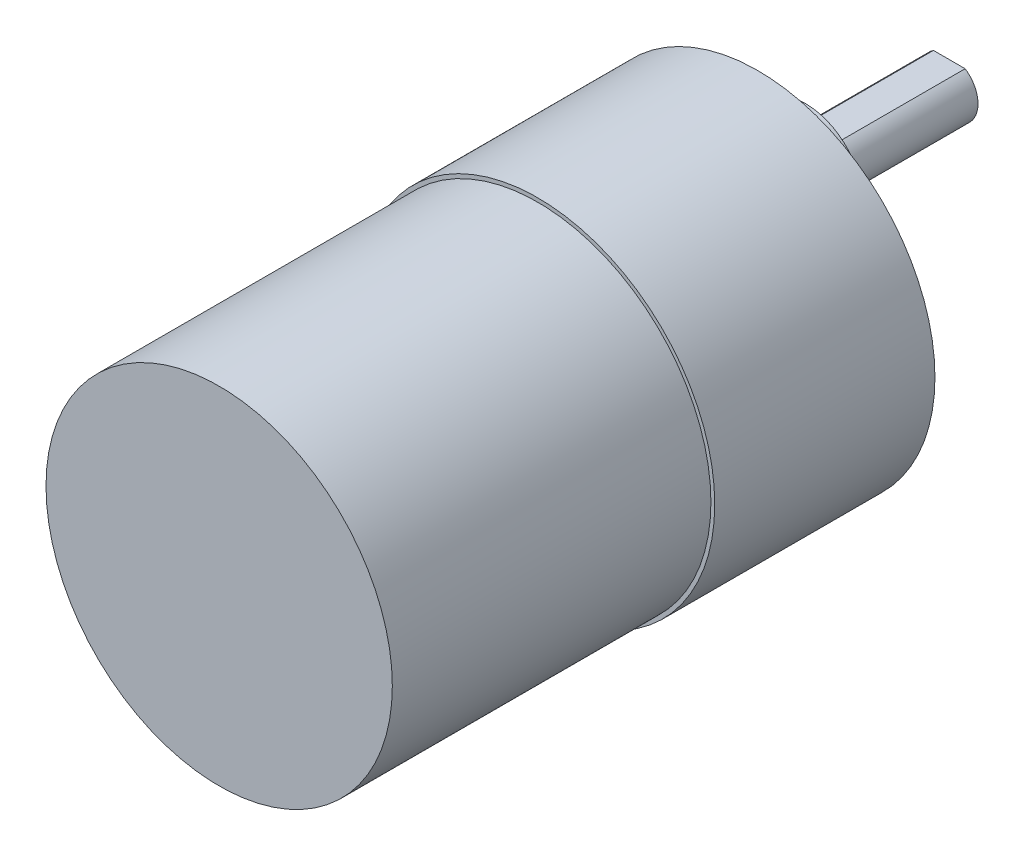
ISO-10303-21;
HEADER;
FILE_DESCRIPTION(('STEP AP214'),'2;1');
FILE_NAME('part.step','',(''),(''),'','','');
FILE_SCHEMA(('AUTOMOTIVE_DESIGN { 1 0 10303 214 1 1 1 1 }'));
ENDSEC;
DATA;
#1=APPLICATION_CONTEXT('core data for automotive mechanical design processes');
#2=APPLICATION_PROTOCOL_DEFINITION('international standard','automotive_design',2000,#1);
#3=PRODUCT_CONTEXT('',#1,'mechanical');
#4=PRODUCT('Part','Part','',(#3));
#5=PRODUCT_RELATED_PRODUCT_CATEGORY('part','',(#4));
#6=PRODUCT_DEFINITION_FORMATION('','',#4);
#7=PRODUCT_DEFINITION_CONTEXT('part definition',#1,'design');
#8=PRODUCT_DEFINITION('design','',#6,#7);
#9=PRODUCT_DEFINITION_SHAPE('','',#8);
#10=(LENGTH_UNIT() NAMED_UNIT(*) SI_UNIT(.MILLI.,.METRE.));
#11=(NAMED_UNIT(*) PLANE_ANGLE_UNIT() SI_UNIT($,.RADIAN.));
#12=(NAMED_UNIT(*) SI_UNIT($,.STERADIAN.) SOLID_ANGLE_UNIT());
#13=UNCERTAINTY_MEASURE_WITH_UNIT(LENGTH_MEASURE(1.E-05),#10,'distance_accuracy_value','');
#14=(GEOMETRIC_REPRESENTATION_CONTEXT(3) GLOBAL_UNCERTAINTY_ASSIGNED_CONTEXT((#13)) GLOBAL_UNIT_ASSIGNED_CONTEXT((#10,
#11,#12)) REPRESENTATION_CONTEXT('',''));
#15=CARTESIAN_POINT('',(0.,0.,0.));
#16=DIRECTION('',(0.,0.,1.));
#17=DIRECTION('',(1.,0.,0.));
#18=AXIS2_PLACEMENT_3D('',#15,#16,#17);
#19=CARTESIAN_POINT('',(0.,0.,23.0161764705882));
#20=DIRECTION('',(0.,0.,-1.));
#21=DIRECTION('',(-1.,0.,0.));
#22=AXIS2_PLACEMENT_3D('',#19,#20,#21);
#23=CYLINDRICAL_SURFACE('',#22,18.5);
#24=CARTESIAN_POINT('',(0.,0.,23.0161764705882));
#25=DIRECTION('',(0.,0.,1.));
#26=DIRECTION('',(1.,0.,0.));
#27=AXIS2_PLACEMENT_3D('',#24,#25,#26);
#28=CIRCLE('',#27,18.5);
#29=CARTESIAN_POINT('',(18.5,0.,23.0161764705882));
#30=VERTEX_POINT('',#29);
#31=EDGE_CURVE('E88',#30,#30,#28,.T.);
#32=ORIENTED_EDGE('',*,*,#31,.F.);
#33=EDGE_LOOP('',(#32));
#34=FACE_BOUND('',#33,.T.);
#35=CARTESIAN_POINT('',(0.,0.,0.));
#36=DIRECTION('',(0.,0.,1.));
#37=DIRECTION('',(1.,0.,0.));
#38=AXIS2_PLACEMENT_3D('',#35,#36,#37);
#39=CIRCLE('',#38,18.5);
#40=CARTESIAN_POINT('',(18.5,0.,0.));
#41=VERTEX_POINT('',#40);
#42=EDGE_CURVE('E84',#41,#41,#39,.T.);
#43=ORIENTED_EDGE('',*,*,#42,.T.);
#44=EDGE_LOOP('',(#43));
#45=FACE_BOUND('',#44,.T.);
#46=ADVANCED_FACE('F34',(#34,#45),#23,.T.);
#47=CARTESIAN_POINT('',(0.,0.,23.0161764705882));
#48=DIRECTION('',(0.,0.,1.));
#49=DIRECTION('',(1.,0.,0.));
#50=AXIS2_PLACEMENT_3D('',#47,#48,#49);
#51=PLANE('',#50);
#52=CARTESIAN_POINT('',(0.,0.,23.0161764705882));
#53=DIRECTION('',(0.,0.,1.));
#54=DIRECTION('',(1.,0.,0.));
#55=AXIS2_PLACEMENT_3D('',#52,#53,#54);
#56=CIRCLE('',#55,18.1);
#57=CARTESIAN_POINT('',(18.1,0.,23.0161764705882));
#58=VERTEX_POINT('',#57);
#59=EDGE_CURVE('E85',#58,#58,#56,.T.);
#60=ORIENTED_EDGE('',*,*,#59,.F.);
#61=EDGE_LOOP('',(#60));
#62=FACE_BOUND('',#61,.T.);
#63=ORIENTED_EDGE('',*,*,#31,.T.);
#64=EDGE_LOOP('',(#63));
#65=FACE_BOUND('',#64,.T.);
#66=ADVANCED_FACE('F97',(#62,#65),#51,.T.);
#67=CARTESIAN_POINT('',(0.,0.,0.));
#68=DIRECTION('',(0.,0.,1.));
#69=DIRECTION('',(1.,0.,0.));
#70=AXIS2_PLACEMENT_3D('',#67,#68,#69);
#71=PLANE('',#70);
#72=CARTESIAN_POINT('',(7.75000000000009,13.4233937586581,0.));
#73=DIRECTION('',(0.,0.,-1.));
#74=DIRECTION('',(-1.,0.,0.));
#75=AXIS2_PLACEMENT_3D('',#72,#73,#74);
#76=CIRCLE('',#75,1.50000000000076);
#77=CARTESIAN_POINT('',(6.24999999999933,13.4233937586581,0.));
#78=VERTEX_POINT('',#77);
#79=EDGE_CURVE('E322',#78,#78,#76,.T.);
#80=ORIENTED_EDGE('',*,*,#79,.F.);
#81=EDGE_LOOP('',(#80));
#82=FACE_BOUND('',#81,.T.);
#83=CARTESIAN_POINT('',(15.4999999999994,-1.08176008225088E-12,0.));
#84=DIRECTION('',(0.,0.,-1.));
#85=DIRECTION('',(-1.,0.,0.));
#86=AXIS2_PLACEMENT_3D('',#83,#84,#85);
#87=CIRCLE('',#86,1.50000000000118);
#88=CARTESIAN_POINT('',(13.9999999999983,-1.08176008225088E-12,0.));
#89=VERTEX_POINT('',#88);
#90=EDGE_CURVE('E321',#89,#89,#87,.T.);
#91=ORIENTED_EDGE('',*,*,#90,.F.);
#92=EDGE_LOOP('',(#91));
#93=FACE_BOUND('',#92,.T.);
#94=CARTESIAN_POINT('',(7.74999999999879,-13.4233937586595,0.));
#95=DIRECTION('',(0.,0.,-1.));
#96=DIRECTION('',(-1.,0.,0.));
#97=AXIS2_PLACEMENT_3D('',#94,#95,#96);
#98=CIRCLE('',#97,1.50000000000096);
#99=CARTESIAN_POINT('',(6.24999999999783,-13.4233937586595,0.));
#100=VERTEX_POINT('',#99);
#101=EDGE_CURVE('E357',#100,#100,#98,.T.);
#102=ORIENTED_EDGE('',*,*,#101,.F.);
#103=EDGE_LOOP('',(#102));
#104=FACE_BOUND('',#103,.T.);
#105=CARTESIAN_POINT('',(-7.75000000000121,-13.4233937586588,0.));
#106=DIRECTION('',(0.,0.,-1.));
#107=DIRECTION('',(-1.,0.,0.));
#108=AXIS2_PLACEMENT_3D('',#105,#106,#107);
#109=CIRCLE('',#108,1.5000000000003);
#110=CARTESIAN_POINT('',(-9.25000000000151,-13.4233937586588,0.));
#111=VERTEX_POINT('',#110);
#112=EDGE_CURVE('E351',#111,#111,#109,.T.);
#113=ORIENTED_EDGE('',*,*,#112,.F.);
#114=EDGE_LOOP('',(#113));
#115=FACE_BOUND('',#114,.T.);
#116=CARTESIAN_POINT('',(-15.5000000000006,4.21937952614402E-13,0.));
#117=DIRECTION('',(0.,0.,-1.));
#118=DIRECTION('',(-1.,0.,0.));
#119=AXIS2_PLACEMENT_3D('',#116,#117,#118);
#120=CIRCLE('',#119,1.49999999999983);
#121=CARTESIAN_POINT('',(-17.0000000000004,4.21937952614402E-13,0.));
#122=VERTEX_POINT('',#121);
#123=EDGE_CURVE('E342',#122,#122,#120,.T.);
#124=ORIENTED_EDGE('',*,*,#123,.F.);
#125=EDGE_LOOP('',(#124));
#126=FACE_BOUND('',#125,.T.);
#127=CARTESIAN_POINT('',(-7.74999999999992,13.4233937586588,0.));
#128=DIRECTION('',(0.,0.,-1.));
#129=DIRECTION('',(-1.,0.,0.));
#130=AXIS2_PLACEMENT_3D('',#127,#128,#129);
#131=CIRCLE('',#130,1.5);
#132=CARTESIAN_POINT('',(-9.24999999999992,13.4233937586588,0.));
#133=VERTEX_POINT('',#132);
#134=EDGE_CURVE('E333',#133,#133,#131,.T.);
#135=ORIENTED_EDGE('',*,*,#134,.F.);
#136=EDGE_LOOP('',(#135));
#137=FACE_BOUND('',#136,.T.);
#138=CARTESIAN_POINT('',(0.,7.,0.));
#139=DIRECTION('',(0.,0.,1.));
#140=DIRECTION('',(1.,0.,0.));
#141=AXIS2_PLACEMENT_3D('',#138,#139,#140);
#142=CIRCLE('',#141,6.);
#143=CARTESIAN_POINT('',(6.,7.,0.));
#144=VERTEX_POINT('',#143);
#145=EDGE_CURVE('E37',#144,#144,#142,.F.);
#146=ORIENTED_EDGE('',*,*,#145,.F.);
#147=EDGE_LOOP('',(#146));
#148=FACE_BOUND('',#147,.T.);
#149=ORIENTED_EDGE('',*,*,#42,.F.);
#150=EDGE_LOOP('',(#149));
#151=FACE_BOUND('',#150,.T.);
#152=ADVANCED_FACE('F94',(#82,#93,#104,#115,#126,#137,#148,#151),#71,.F.);
#153=CARTESIAN_POINT('',(0.,0.,56.3161764705882));
#154=DIRECTION('',(0.,0.,-1.));
#155=DIRECTION('',(-1.,0.,0.));
#156=AXIS2_PLACEMENT_3D('',#153,#154,#155);
#157=CYLINDRICAL_SURFACE('',#156,18.1);
#158=CARTESIAN_POINT('',(0.,0.,56.3161764705882));
#159=DIRECTION('',(0.,0.,1.));
#160=DIRECTION('',(1.,0.,0.));
#161=AXIS2_PLACEMENT_3D('',#158,#159,#160);
#162=CIRCLE('',#161,18.1);
#163=CARTESIAN_POINT('',(18.1,0.,56.3161764705882));
#164=VERTEX_POINT('',#163);
#165=EDGE_CURVE('E78',#164,#164,#162,.T.);
#166=ORIENTED_EDGE('',*,*,#165,.F.);
#167=EDGE_LOOP('',(#166));
#168=FACE_BOUND('',#167,.T.);
#169=ORIENTED_EDGE('',*,*,#59,.T.);
#170=EDGE_LOOP('',(#169));
#171=FACE_BOUND('',#170,.T.);
#172=ADVANCED_FACE('F96',(#168,#171),#157,.T.);
#173=CARTESIAN_POINT('',(0.,0.,56.3161764705882));
#174=DIRECTION('',(0.,0.,1.));
#175=DIRECTION('',(1.,0.,0.));
#176=AXIS2_PLACEMENT_3D('',#173,#174,#175);
#177=PLANE('',#176);
#178=ORIENTED_EDGE('',*,*,#165,.T.);
#179=EDGE_LOOP('',(#178));
#180=FACE_BOUND('',#179,.T.);
#181=ADVANCED_FACE('F103',(#180),#177,.T.);
#182=CARTESIAN_POINT('',(0.,7.,-5.));
#183=DIRECTION('',(0.,0.,1.));
#184=DIRECTION('',(1.,0.,0.));
#185=AXIS2_PLACEMENT_3D('',#182,#183,#184);
#186=CYLINDRICAL_SURFACE('',#185,6.);
#187=CARTESIAN_POINT('',(0.,7.,-5.));
#188=DIRECTION('',(0.,0.,-1.));
#189=DIRECTION('',(-1.,0.,0.));
#190=AXIS2_PLACEMENT_3D('',#187,#188,#189);
#191=CIRCLE('',#190,6.);
#192=CARTESIAN_POINT('',(-6.,7.,-5.));
#193=VERTEX_POINT('',#192);
#194=EDGE_CURVE('E75',#193,#193,#191,.T.);
#195=ORIENTED_EDGE('',*,*,#194,.F.);
#196=EDGE_LOOP('',(#195));
#197=FACE_BOUND('',#196,.T.);
#198=ORIENTED_EDGE('',*,*,#145,.T.);
#199=EDGE_LOOP('',(#198));
#200=FACE_BOUND('',#199,.T.);
#201=ADVANCED_FACE('F136',(#197,#200),#186,.T.);
#202=CARTESIAN_POINT('',(0.,7.,-5.));
#203=DIRECTION('',(0.,0.,-1.));
#204=DIRECTION('',(-1.,0.,0.));
#205=AXIS2_PLACEMENT_3D('',#202,#203,#204);
#206=PLANE('',#205);
#207=CARTESIAN_POINT('',(0.,7.,-5.));
#208=DIRECTION('',(0.,0.,-1.));
#209=DIRECTION('',(-1.,0.,0.));
#210=AXIS2_PLACEMENT_3D('',#207,#208,#209);
#211=CIRCLE('',#210,3.);
#212=CARTESIAN_POINT('',(-3.,7.,-5.));
#213=VERTEX_POINT('',#212);
#214=EDGE_CURVE('E11',#213,#213,#211,.T.);
#215=ORIENTED_EDGE('',*,*,#214,.F.);
#216=EDGE_LOOP('',(#215));
#217=FACE_BOUND('',#216,.T.);
#218=ORIENTED_EDGE('',*,*,#194,.T.);
#219=EDGE_LOOP('',(#218));
#220=FACE_BOUND('',#219,.T.);
#221=ADVANCED_FACE('F146',(#217,#220),#206,.T.);
#222=CARTESIAN_POINT('',(0.,7.,-20.));
#223=DIRECTION('',(0.,0.,1.));
#224=DIRECTION('',(1.,0.,0.));
#225=AXIS2_PLACEMENT_3D('',#222,#223,#224);
#226=CYLINDRICAL_SURFACE('',#225,3.);
#227=CARTESIAN_POINT('',(0.,7.,-20.));
#228=DIRECTION('',(0.,0.,-1.));
#229=DIRECTION('',(1.,0.,0.));
#230=AXIS2_PLACEMENT_3D('',#227,#228,#229);
#231=CIRCLE('',#230,3.);
#232=CARTESIAN_POINT('',(1.6583123951777,9.5,-20.));
#233=VERTEX_POINT('',#232);
#234=CARTESIAN_POINT('',(-1.6583123951777,9.5,-20.));
#235=VERTEX_POINT('',#234);
#236=EDGE_CURVE('E72',#233,#235,#231,.T.);
#237=ORIENTED_EDGE('',*,*,#236,.F.);
#238=DIRECTION('',(0.,0.,-1.));
#239=VECTOR('',#238,1.);
#240=CARTESIAN_POINT('',(1.6583123951777,9.5,-6.));
#241=LINE('',#240,#239);
#242=CARTESIAN_POINT('',(1.6583123951777,9.5,-6.));
#243=VERTEX_POINT('',#242);
#244=EDGE_CURVE('E49',#243,#233,#241,.T.);
#245=ORIENTED_EDGE('',*,*,#244,.F.);
#246=CARTESIAN_POINT('',(0.,7.,-6.));
#247=DIRECTION('',(0.,0.,-1.));
#248=DIRECTION('',(-1.,0.,0.));
#249=AXIS2_PLACEMENT_3D('',#246,#247,#248);
#250=CIRCLE('',#249,3.);
#251=CARTESIAN_POINT('',(-1.6583123951777,9.5,-6.));
#252=VERTEX_POINT('',#251);
#253=EDGE_CURVE('E65',#252,#243,#250,.T.);
#254=ORIENTED_EDGE('',*,*,#253,.F.);
#255=DIRECTION('',(0.,0.,-1.));
#256=VECTOR('',#255,1.);
#257=CARTESIAN_POINT('',(-1.6583123951777,9.5,-6.));
#258=LINE('',#257,#256);
#259=EDGE_CURVE('E55',#252,#235,#258,.T.);
#260=ORIENTED_EDGE('',*,*,#259,.T.);
#261=EDGE_LOOP('',(#237,#245,#254,#260));
#262=FACE_BOUND('',#261,.T.);
#263=ORIENTED_EDGE('',*,*,#214,.T.);
#264=EDGE_LOOP('',(#263));
#265=FACE_BOUND('',#264,.T.);
#266=ADVANCED_FACE('F70',(#262,#265),#226,.T.);
#267=CARTESIAN_POINT('',(0.,7.,-20.));
#268=DIRECTION('',(0.,0.,1.));
#269=DIRECTION('',(1.,0.,0.));
#270=AXIS2_PLACEMENT_3D('',#267,#268,#269);
#271=PLANE('',#270);
#272=ORIENTED_EDGE('',*,*,#236,.T.);
#273=DIRECTION('',(-1.,0.,0.));
#274=VECTOR('',#273,1.);
#275=CARTESIAN_POINT('',(1.6583123951777,9.5,-20.));
#276=LINE('',#275,#274);
#277=EDGE_CURVE('E60',#233,#235,#276,.T.);
#278=ORIENTED_EDGE('',*,*,#277,.F.);
#279=EDGE_LOOP('',(#272,#278));
#280=FACE_BOUND('',#279,.T.);
#281=ADVANCED_FACE('F74',(#280),#271,.F.);
#282=CARTESIAN_POINT('',(1.6583123951777,9.5,-6.));
#283=DIRECTION('',(0.,-1.,0.));
#284=DIRECTION('',(0.,0.,-1.));
#285=AXIS2_PLACEMENT_3D('',#282,#283,#284);
#286=PLANE('',#285);
#287=ORIENTED_EDGE('',*,*,#277,.T.);
#288=ORIENTED_EDGE('',*,*,#259,.F.);
#289=DIRECTION('',(-1.,0.,0.));
#290=VECTOR('',#289,1.);
#291=CARTESIAN_POINT('',(1.6583123951777,9.5,-6.));
#292=LINE('',#291,#290);
#293=EDGE_CURVE('E338',#243,#252,#292,.T.);
#294=ORIENTED_EDGE('',*,*,#293,.F.);
#295=ORIENTED_EDGE('',*,*,#244,.T.);
#296=EDGE_LOOP('',(#287,#288,#294,#295));
#297=FACE_BOUND('',#296,.T.);
#298=ADVANCED_FACE('F61',(#297),#286,.F.);
#299=CARTESIAN_POINT('',(0.,7.,-6.));
#300=DIRECTION('',(0.,0.,-1.));
#301=DIRECTION('',(-1.,0.,0.));
#302=AXIS2_PLACEMENT_3D('',#299,#300,#301);
#303=PLANE('',#302);
#304=ORIENTED_EDGE('',*,*,#253,.T.);
#305=ORIENTED_EDGE('',*,*,#293,.T.);
#306=EDGE_LOOP('',(#304,#305));
#307=FACE_BOUND('',#306,.T.);
#308=ADVANCED_FACE('F182',(#307),#303,.T.);
#309=CARTESIAN_POINT('',(-7.74999999999992,13.4233937586588,8.));
#310=DIRECTION('',(0.,0.,-1.));
#311=DIRECTION('',(-1.,0.,0.));
#312=AXIS2_PLACEMENT_3D('',#309,#310,#311);
#313=CYLINDRICAL_SURFACE('',#312,1.5);
#314=CARTESIAN_POINT('',(-7.74999999999992,13.4233937586588,8.));
#315=DIRECTION('',(0.,0.,-1.));
#316=DIRECTION('',(-1.,0.,0.));
#317=AXIS2_PLACEMENT_3D('',#314,#315,#316);
#318=CIRCLE('',#317,1.5);
#319=CARTESIAN_POINT('',(-9.24999999999992,13.4233937586588,8.));
#320=VERTEX_POINT('',#319);
#321=EDGE_CURVE('E66',#320,#320,#318,.T.);
#322=ORIENTED_EDGE('',*,*,#321,.F.);
#323=EDGE_LOOP('',(#322));
#324=FACE_BOUND('',#323,.T.);
#325=ORIENTED_EDGE('',*,*,#134,.T.);
#326=EDGE_LOOP('',(#325));
#327=FACE_BOUND('',#326,.T.);
#328=ADVANCED_FACE('F190',(#324,#327),#313,.F.);
#329=CARTESIAN_POINT('',(-7.74999999999992,13.4233937586588,8.));
#330=DIRECTION('',(0.,0.,-1.));
#331=DIRECTION('',(-1.,0.,0.));
#332=AXIS2_PLACEMENT_3D('',#329,#330,#331);
#333=PLANE('',#332);
#334=ORIENTED_EDGE('',*,*,#321,.T.);
#335=EDGE_LOOP('',(#334));
#336=FACE_BOUND('',#335,.T.);
#337=ADVANCED_FACE('F204',(#336),#333,.T.);
#338=CARTESIAN_POINT('',(-15.5000000000006,4.21937952614402E-13,8.));
#339=DIRECTION('',(0.,0.,-1.));
#340=DIRECTION('',(-1.,0.,0.));
#341=AXIS2_PLACEMENT_3D('',#338,#339,#340);
#342=CYLINDRICAL_SURFACE('',#341,1.49999999999983);
#343=CARTESIAN_POINT('',(-15.5000000000006,4.21937952614402E-13,8.));
#344=DIRECTION('',(0.,0.,-1.));
#345=DIRECTION('',(-1.,0.,0.));
#346=AXIS2_PLACEMENT_3D('',#343,#344,#345);
#347=CIRCLE('',#346,1.49999999999983);
#348=CARTESIAN_POINT('',(-17.0000000000004,4.21937952614402E-13,8.));
#349=VERTEX_POINT('',#348);
#350=EDGE_CURVE('E336',#349,#349,#347,.T.);
#351=ORIENTED_EDGE('',*,*,#350,.F.);
#352=EDGE_LOOP('',(#351));
#353=FACE_BOUND('',#352,.T.);
#354=ORIENTED_EDGE('',*,*,#123,.T.);
#355=EDGE_LOOP('',(#354));
#356=FACE_BOUND('',#355,.T.);
#357=ADVANCED_FACE('F214',(#353,#356),#342,.F.);
#358=CARTESIAN_POINT('',(-15.5000000000006,4.21937952614402E-13,8.));
#359=DIRECTION('',(0.,0.,-1.));
#360=DIRECTION('',(-1.,0.,0.));
#361=AXIS2_PLACEMENT_3D('',#358,#359,#360);
#362=PLANE('',#361);
#363=ORIENTED_EDGE('',*,*,#350,.T.);
#364=EDGE_LOOP('',(#363));
#365=FACE_BOUND('',#364,.T.);
#366=ADVANCED_FACE('F224',(#365),#362,.T.);
#367=CARTESIAN_POINT('',(-7.75000000000121,-13.4233937586588,8.));
#368=DIRECTION('',(0.,0.,-1.));
#369=DIRECTION('',(-1.,0.,0.));
#370=AXIS2_PLACEMENT_3D('',#367,#368,#369);
#371=CYLINDRICAL_SURFACE('',#370,1.5000000000003);
#372=CARTESIAN_POINT('',(-7.75000000000121,-13.4233937586588,8.));
#373=DIRECTION('',(0.,0.,-1.));
#374=DIRECTION('',(-1.,0.,0.));
#375=AXIS2_PLACEMENT_3D('',#372,#373,#374);
#376=CIRCLE('',#375,1.5000000000003);
#377=CARTESIAN_POINT('',(-9.25000000000151,-13.4233937586588,8.));
#378=VERTEX_POINT('',#377);
#379=EDGE_CURVE('E346',#378,#378,#376,.T.);
#380=ORIENTED_EDGE('',*,*,#379,.F.);
#381=EDGE_LOOP('',(#380));
#382=FACE_BOUND('',#381,.T.);
#383=ORIENTED_EDGE('',*,*,#112,.T.);
#384=EDGE_LOOP('',(#383));
#385=FACE_BOUND('',#384,.T.);
#386=ADVANCED_FACE('F234',(#382,#385),#371,.F.);
#387=CARTESIAN_POINT('',(-7.75000000000121,-13.4233937586588,8.));
#388=DIRECTION('',(0.,0.,-1.));
#389=DIRECTION('',(-1.,0.,0.));
#390=AXIS2_PLACEMENT_3D('',#387,#388,#389);
#391=PLANE('',#390);
#392=ORIENTED_EDGE('',*,*,#379,.T.);
#393=EDGE_LOOP('',(#392));
#394=FACE_BOUND('',#393,.T.);
#395=ADVANCED_FACE('F244',(#394),#391,.T.);
#396=CARTESIAN_POINT('',(7.74999999999879,-13.4233937586595,8.));
#397=DIRECTION('',(0.,0.,-1.));
#398=DIRECTION('',(-1.,0.,0.));
#399=AXIS2_PLACEMENT_3D('',#396,#397,#398);
#400=CYLINDRICAL_SURFACE('',#399,1.50000000000096);
#401=CARTESIAN_POINT('',(7.74999999999879,-13.4233937586595,8.));
#402=DIRECTION('',(0.,0.,-1.));
#403=DIRECTION('',(-1.,0.,0.));
#404=AXIS2_PLACEMENT_3D('',#401,#402,#403);
#405=CIRCLE('',#404,1.50000000000096);
#406=CARTESIAN_POINT('',(6.24999999999783,-13.4233937586595,8.));
#407=VERTEX_POINT('',#406);
#408=EDGE_CURVE('E354',#407,#407,#405,.T.);
#409=ORIENTED_EDGE('',*,*,#408,.F.);
#410=EDGE_LOOP('',(#409));
#411=FACE_BOUND('',#410,.T.);
#412=ORIENTED_EDGE('',*,*,#101,.T.);
#413=EDGE_LOOP('',(#412));
#414=FACE_BOUND('',#413,.T.);
#415=ADVANCED_FACE('F254',(#411,#414),#400,.F.);
#416=CARTESIAN_POINT('',(7.74999999999879,-13.4233937586595,8.));
#417=DIRECTION('',(0.,0.,-1.));
#418=DIRECTION('',(-1.,0.,0.));
#419=AXIS2_PLACEMENT_3D('',#416,#417,#418);
#420=PLANE('',#419);
#421=ORIENTED_EDGE('',*,*,#408,.T.);
#422=EDGE_LOOP('',(#421));
#423=FACE_BOUND('',#422,.T.);
#424=ADVANCED_FACE('F264',(#423),#420,.T.);
#425=CARTESIAN_POINT('',(15.4999999999994,-1.08176008225088E-12,8.));
#426=DIRECTION('',(0.,0.,-1.));
#427=DIRECTION('',(-1.,0.,0.));
#428=AXIS2_PLACEMENT_3D('',#425,#426,#427);
#429=CYLINDRICAL_SURFACE('',#428,1.50000000000118);
#430=CARTESIAN_POINT('',(15.4999999999994,-1.08176008225088E-12,8.));
#431=DIRECTION('',(0.,0.,-1.));
#432=DIRECTION('',(-1.,0.,0.));
#433=AXIS2_PLACEMENT_3D('',#430,#431,#432);
#434=CIRCLE('',#433,1.50000000000118);
#435=CARTESIAN_POINT('',(13.9999999999983,-1.08176008225088E-12,8.));
#436=VERTEX_POINT('',#435);
#437=EDGE_CURVE('E325',#436,#436,#434,.T.);
#438=ORIENTED_EDGE('',*,*,#437,.F.);
#439=EDGE_LOOP('',(#438));
#440=FACE_BOUND('',#439,.T.);
#441=ORIENTED_EDGE('',*,*,#90,.T.);
#442=EDGE_LOOP('',(#441));
#443=FACE_BOUND('',#442,.T.);
#444=ADVANCED_FACE('F274',(#440,#443),#429,.F.);
#445=CARTESIAN_POINT('',(15.4999999999994,-1.08176008225088E-12,8.));
#446=DIRECTION('',(0.,0.,-1.));
#447=DIRECTION('',(-1.,0.,0.));
#448=AXIS2_PLACEMENT_3D('',#445,#446,#447);
#449=PLANE('',#448);
#450=ORIENTED_EDGE('',*,*,#437,.T.);
#451=EDGE_LOOP('',(#450));
#452=FACE_BOUND('',#451,.T.);
#453=ADVANCED_FACE('F284',(#452),#449,.T.);
#454=CARTESIAN_POINT('',(7.75000000000009,13.4233937586581,8.));
#455=DIRECTION('',(0.,0.,-1.));
#456=DIRECTION('',(-1.,0.,0.));
#457=AXIS2_PLACEMENT_3D('',#454,#455,#456);
#458=CYLINDRICAL_SURFACE('',#457,1.50000000000076);
#459=CARTESIAN_POINT('',(7.75000000000009,13.4233937586581,8.));
#460=DIRECTION('',(0.,0.,-1.));
#461=DIRECTION('',(-1.,0.,0.));
#462=AXIS2_PLACEMENT_3D('',#459,#460,#461);
#463=CIRCLE('',#462,1.50000000000076);
#464=CARTESIAN_POINT('',(6.24999999999933,13.4233937586581,8.));
#465=VERTEX_POINT('',#464);
#466=EDGE_CURVE('E320',#465,#465,#463,.T.);
#467=ORIENTED_EDGE('',*,*,#466,.F.);
#468=EDGE_LOOP('',(#467));
#469=FACE_BOUND('',#468,.T.);
#470=ORIENTED_EDGE('',*,*,#79,.T.);
#471=EDGE_LOOP('',(#470));
#472=FACE_BOUND('',#471,.T.);
#473=ADVANCED_FACE('F294',(#469,#472),#458,.F.);
#474=CARTESIAN_POINT('',(7.75000000000009,13.4233937586581,8.));
#475=DIRECTION('',(0.,0.,-1.));
#476=DIRECTION('',(-1.,0.,0.));
#477=AXIS2_PLACEMENT_3D('',#474,#475,#476);
#478=PLANE('',#477);
#479=ORIENTED_EDGE('',*,*,#466,.T.);
#480=EDGE_LOOP('',(#479));
#481=FACE_BOUND('',#480,.T.);
#482=ADVANCED_FACE('F304',(#481),#478,.T.);
#483=CLOSED_SHELL('',(#46,#66,#152,#172,#181,#201,#221,#266,#281,#298,#308,#328,#337,#357,#366,
#386,#395,#415,#424,#444,#453,#473,#482));
#484=MANIFOLD_SOLID_BREP('B2',#483);
#485=ADVANCED_BREP_SHAPE_REPRESENTATION('',(#18,#484),#14);
#486=SHAPE_DEFINITION_REPRESENTATION(#9,#485);
ENDSEC;
END-ISO-10303-21;
